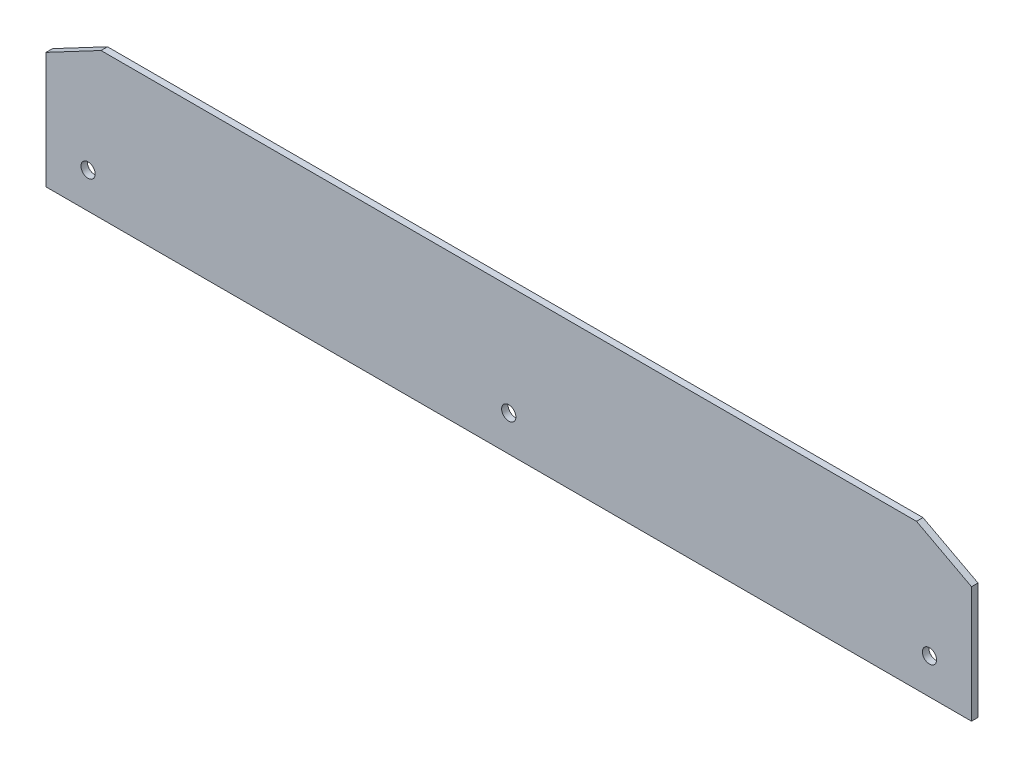
ISO-10303-21;
HEADER;
FILE_DESCRIPTION(('STEP AP214'),'2;1');
FILE_NAME('part.step','',(''),(''),'','','');
FILE_SCHEMA(('AUTOMOTIVE_DESIGN { 1 0 10303 214 1 1 1 1 }'));
ENDSEC;
DATA;
#1=APPLICATION_CONTEXT('core data for automotive mechanical design processes');
#2=APPLICATION_PROTOCOL_DEFINITION('international standard','automotive_design',2000,#1);
#3=PRODUCT_CONTEXT('',#1,'mechanical');
#4=PRODUCT('Part','Part','',(#3));
#5=PRODUCT_RELATED_PRODUCT_CATEGORY('part','',(#4));
#6=PRODUCT_DEFINITION_FORMATION('','',#4);
#7=PRODUCT_DEFINITION_CONTEXT('part definition',#1,'design');
#8=PRODUCT_DEFINITION('design','',#6,#7);
#9=PRODUCT_DEFINITION_SHAPE('','',#8);
#10=(LENGTH_UNIT() NAMED_UNIT(*) SI_UNIT(.MILLI.,.METRE.));
#11=(NAMED_UNIT(*) PLANE_ANGLE_UNIT() SI_UNIT($,.RADIAN.));
#12=(NAMED_UNIT(*) SI_UNIT($,.STERADIAN.) SOLID_ANGLE_UNIT());
#13=UNCERTAINTY_MEASURE_WITH_UNIT(LENGTH_MEASURE(1.E-05),#10,'distance_accuracy_value','');
#14=(GEOMETRIC_REPRESENTATION_CONTEXT(3) GLOBAL_UNCERTAINTY_ASSIGNED_CONTEXT((#13)) GLOBAL_UNIT_ASSIGNED_CONTEXT((#10,
#11,#12)) REPRESENTATION_CONTEXT('',''));
#15=CARTESIAN_POINT('',(0.,0.,0.));
#16=DIRECTION('',(0.,0.,1.));
#17=DIRECTION('',(1.,0.,0.));
#18=AXIS2_PLACEMENT_3D('',#15,#16,#17);
#19=CARTESIAN_POINT('',(0.,0.,2.));
#20=DIRECTION('',(0.,0.,1.));
#21=DIRECTION('',(1.,0.,0.));
#22=AXIS2_PLACEMENT_3D('',#19,#20,#21);
#23=PLANE('',#22);
#24=CARTESIAN_POINT('',(0.,18.,2.));
#25=DIRECTION('',(0.,0.,1.));
#26=DIRECTION('',(1.,0.,0.));
#27=AXIS2_PLACEMENT_3D('',#24,#25,#26);
#28=CIRCLE('',#27,2.2);
#29=CARTESIAN_POINT('',(2.2,18.,2.));
#30=VERTEX_POINT('',#29);
#31=EDGE_CURVE('E211',#30,#30,#28,.T.);
#32=ORIENTED_EDGE('',*,*,#31,.F.);
#33=EDGE_LOOP('',(#32));
#34=FACE_BOUND('',#33,.T.);
#35=DIRECTION('',(0.,-1.,0.));
#36=VECTOR('',#35,1.);
#37=CARTESIAN_POINT('',(-143.,43.,2.));
#38=LINE('',#37,#36);
#39=CARTESIAN_POINT('',(-143.,43.,2.));
#40=VERTEX_POINT('',#39);
#41=CARTESIAN_POINT('',(-143.,7.,2.));
#42=VERTEX_POINT('',#41);
#43=EDGE_CURVE('E154',#40,#42,#38,.T.);
#44=ORIENTED_EDGE('',*,*,#43,.T.);
#45=DIRECTION('',(1.,0.,0.));
#46=VECTOR('',#45,1.);
#47=CARTESIAN_POINT('',(-143.,7.,2.));
#48=LINE('',#47,#46);
#49=CARTESIAN_POINT('',(143.,7.,2.));
#50=VERTEX_POINT('',#49);
#51=EDGE_CURVE('E100',#42,#50,#48,.T.);
#52=ORIENTED_EDGE('',*,*,#51,.T.);
#53=DIRECTION('',(0.,1.,0.));
#54=VECTOR('',#53,1.);
#55=CARTESIAN_POINT('',(143.,7.,2.));
#56=LINE('',#55,#54);
#57=CARTESIAN_POINT('',(143.,43.,2.));
#58=VERTEX_POINT('',#57);
#59=EDGE_CURVE('E113',#50,#58,#56,.T.);
#60=ORIENTED_EDGE('',*,*,#59,.T.);
#61=DIRECTION('',(-0.883787916347062,0.467887720419033,0.));
#62=VECTOR('',#61,1.);
#63=CARTESIAN_POINT('',(143.,43.,2.));
#64=LINE('',#63,#62);
#65=CARTESIAN_POINT('',(126.,52.,2.));
#66=VERTEX_POINT('',#65);
#67=EDGE_CURVE('E107',#58,#66,#64,.T.);
#68=ORIENTED_EDGE('',*,*,#67,.T.);
#69=DIRECTION('',(-1.,0.,0.));
#70=VECTOR('',#69,1.);
#71=CARTESIAN_POINT('',(126.,52.,2.));
#72=LINE('',#71,#70);
#73=CARTESIAN_POINT('',(-126.,52.,2.));
#74=VERTEX_POINT('',#73);
#75=EDGE_CURVE('E111',#66,#74,#72,.T.);
#76=ORIENTED_EDGE('',*,*,#75,.T.);
#77=DIRECTION('',(-0.883787916347062,-0.467887720419033,0.));
#78=VECTOR('',#77,1.);
#79=CARTESIAN_POINT('',(-126.,52.,2.));
#80=LINE('',#79,#78);
#81=EDGE_CURVE('E63',#74,#40,#80,.T.);
#82=ORIENTED_EDGE('',*,*,#81,.T.);
#83=EDGE_LOOP('',(#44,#52,#60,#68,#76,#82));
#84=FACE_BOUND('',#83,.T.);
#85=CARTESIAN_POINT('',(-130.,18.,2.));
#86=DIRECTION('',(0.,0.,1.));
#87=DIRECTION('',(1.,0.,0.));
#88=AXIS2_PLACEMENT_3D('',#85,#86,#87);
#89=CIRCLE('',#88,2.20000000000001);
#90=CARTESIAN_POINT('',(-127.8,18.,2.));
#91=VERTEX_POINT('',#90);
#92=EDGE_CURVE('E142',#91,#91,#89,.T.);
#93=ORIENTED_EDGE('',*,*,#92,.F.);
#94=EDGE_LOOP('',(#93));
#95=FACE_BOUND('',#94,.T.);
#96=CARTESIAN_POINT('',(130.,18.,2.));
#97=DIRECTION('',(0.,0.,1.));
#98=DIRECTION('',(1.,0.,0.));
#99=AXIS2_PLACEMENT_3D('',#96,#97,#98);
#100=CIRCLE('',#99,2.20000000000001);
#101=CARTESIAN_POINT('',(132.2,18.,2.));
#102=VERTEX_POINT('',#101);
#103=EDGE_CURVE('E201',#102,#102,#100,.T.);
#104=ORIENTED_EDGE('',*,*,#103,.F.);
#105=EDGE_LOOP('',(#104));
#106=FACE_BOUND('',#105,.T.);
#107=ADVANCED_FACE('F45',(#34,#84,#95,#106),#23,.T.);
#108=CARTESIAN_POINT('',(0.,0.,0.));
#109=DIRECTION('',(0.,0.,1.));
#110=DIRECTION('',(1.,0.,0.));
#111=AXIS2_PLACEMENT_3D('',#108,#109,#110);
#112=PLANE('',#111);
#113=DIRECTION('',(0.,-1.,0.));
#114=VECTOR('',#113,1.);
#115=CARTESIAN_POINT('',(-143.,43.,0.));
#116=LINE('',#115,#114);
#117=CARTESIAN_POINT('',(-143.,43.,0.));
#118=VERTEX_POINT('',#117);
#119=CARTESIAN_POINT('',(-143.,7.,0.));
#120=VERTEX_POINT('',#119);
#121=EDGE_CURVE('E137',#118,#120,#116,.T.);
#122=ORIENTED_EDGE('',*,*,#121,.F.);
#123=DIRECTION('',(-0.883787916347062,-0.467887720419033,0.));
#124=VECTOR('',#123,1.);
#125=CARTESIAN_POINT('',(-126.,52.,0.));
#126=LINE('',#125,#124);
#127=CARTESIAN_POINT('',(-126.,52.,0.));
#128=VERTEX_POINT('',#127);
#129=EDGE_CURVE('E92',#128,#118,#126,.T.);
#130=ORIENTED_EDGE('',*,*,#129,.F.);
#131=DIRECTION('',(-1.,0.,0.));
#132=VECTOR('',#131,1.);
#133=CARTESIAN_POINT('',(126.,52.,0.));
#134=LINE('',#133,#132);
#135=CARTESIAN_POINT('',(126.,52.,0.));
#136=VERTEX_POINT('',#135);
#137=EDGE_CURVE('E86',#136,#128,#134,.T.);
#138=ORIENTED_EDGE('',*,*,#137,.F.);
#139=DIRECTION('',(-0.883787916347062,0.467887720419033,0.));
#140=VECTOR('',#139,1.);
#141=CARTESIAN_POINT('',(143.,43.,0.));
#142=LINE('',#141,#140);
#143=CARTESIAN_POINT('',(143.,43.,0.));
#144=VERTEX_POINT('',#143);
#145=EDGE_CURVE('E122',#144,#136,#142,.T.);
#146=ORIENTED_EDGE('',*,*,#145,.F.);
#147=DIRECTION('',(0.,1.,0.));
#148=VECTOR('',#147,1.);
#149=CARTESIAN_POINT('',(143.,7.,0.));
#150=LINE('',#149,#148);
#151=CARTESIAN_POINT('',(143.,7.,0.));
#152=VERTEX_POINT('',#151);
#153=EDGE_CURVE('E145',#152,#144,#150,.T.);
#154=ORIENTED_EDGE('',*,*,#153,.F.);
#155=DIRECTION('',(1.,0.,0.));
#156=VECTOR('',#155,1.);
#157=CARTESIAN_POINT('',(-143.,7.,0.));
#158=LINE('',#157,#156);
#159=EDGE_CURVE('E141',#120,#152,#158,.T.);
#160=ORIENTED_EDGE('',*,*,#159,.F.);
#161=EDGE_LOOP('',(#122,#130,#138,#146,#154,#160));
#162=FACE_BOUND('',#161,.T.);
#163=CARTESIAN_POINT('',(-130.,18.,0.));
#164=DIRECTION('',(0.,0.,1.));
#165=DIRECTION('',(1.,0.,0.));
#166=AXIS2_PLACEMENT_3D('',#163,#164,#165);
#167=CIRCLE('',#166,2.20000000000001);
#168=CARTESIAN_POINT('',(-127.8,18.,0.));
#169=VERTEX_POINT('',#168);
#170=EDGE_CURVE('E215',#169,#169,#167,.T.);
#171=ORIENTED_EDGE('',*,*,#170,.T.);
#172=EDGE_LOOP('',(#171));
#173=FACE_BOUND('',#172,.T.);
#174=CARTESIAN_POINT('',(0.,18.,0.));
#175=DIRECTION('',(0.,0.,1.));
#176=DIRECTION('',(1.,0.,0.));
#177=AXIS2_PLACEMENT_3D('',#174,#175,#176);
#178=CIRCLE('',#177,2.2);
#179=CARTESIAN_POINT('',(2.2,18.,0.));
#180=VERTEX_POINT('',#179);
#181=EDGE_CURVE('E208',#180,#180,#178,.T.);
#182=ORIENTED_EDGE('',*,*,#181,.T.);
#183=EDGE_LOOP('',(#182));
#184=FACE_BOUND('',#183,.T.);
#185=CARTESIAN_POINT('',(130.,18.,0.));
#186=DIRECTION('',(0.,0.,1.));
#187=DIRECTION('',(1.,0.,0.));
#188=AXIS2_PLACEMENT_3D('',#185,#186,#187);
#189=CIRCLE('',#188,2.20000000000001);
#190=CARTESIAN_POINT('',(132.2,18.,0.));
#191=VERTEX_POINT('',#190);
#192=EDGE_CURVE('E204',#191,#191,#189,.T.);
#193=ORIENTED_EDGE('',*,*,#192,.T.);
#194=EDGE_LOOP('',(#193));
#195=FACE_BOUND('',#194,.T.);
#196=ADVANCED_FACE('F167',(#162,#173,#184,#195),#112,.F.);
#197=CARTESIAN_POINT('',(-143.,43.,2.));
#198=DIRECTION('',(1.,0.,0.));
#199=DIRECTION('',(0.,0.,-1.));
#200=AXIS2_PLACEMENT_3D('',#197,#198,#199);
#201=PLANE('',#200);
#202=ORIENTED_EDGE('',*,*,#121,.T.);
#203=DIRECTION('',(0.,0.,-1.));
#204=VECTOR('',#203,1.);
#205=CARTESIAN_POINT('',(-143.,7.,2.));
#206=LINE('',#205,#204);
#207=EDGE_CURVE('E11',#42,#120,#206,.T.);
#208=ORIENTED_EDGE('',*,*,#207,.F.);
#209=ORIENTED_EDGE('',*,*,#43,.F.);
#210=DIRECTION('',(0.,0.,-1.));
#211=VECTOR('',#210,1.);
#212=CARTESIAN_POINT('',(-143.,43.,2.));
#213=LINE('',#212,#211);
#214=EDGE_CURVE('E133',#40,#118,#213,.T.);
#215=ORIENTED_EDGE('',*,*,#214,.T.);
#216=EDGE_LOOP('',(#202,#208,#209,#215));
#217=FACE_BOUND('',#216,.T.);
#218=ADVANCED_FACE('F47',(#217),#201,.F.);
#219=CARTESIAN_POINT('',(-143.,7.,2.));
#220=DIRECTION('',(0.,1.,0.));
#221=DIRECTION('',(0.,0.,1.));
#222=AXIS2_PLACEMENT_3D('',#219,#220,#221);
#223=PLANE('',#222);
#224=ORIENTED_EDGE('',*,*,#159,.T.);
#225=DIRECTION('',(0.,0.,-1.));
#226=VECTOR('',#225,1.);
#227=CARTESIAN_POINT('',(143.,7.,2.));
#228=LINE('',#227,#226);
#229=EDGE_CURVE('E55',#50,#152,#228,.T.);
#230=ORIENTED_EDGE('',*,*,#229,.F.);
#231=ORIENTED_EDGE('',*,*,#51,.F.);
#232=ORIENTED_EDGE('',*,*,#207,.T.);
#233=EDGE_LOOP('',(#224,#230,#231,#232));
#234=FACE_BOUND('',#233,.T.);
#235=ADVANCED_FACE('F270',(#234),#223,.F.);
#236=CARTESIAN_POINT('',(143.,7.,2.));
#237=DIRECTION('',(-1.,0.,0.));
#238=DIRECTION('',(0.,0.,1.));
#239=AXIS2_PLACEMENT_3D('',#236,#237,#238);
#240=PLANE('',#239);
#241=ORIENTED_EDGE('',*,*,#153,.T.);
#242=DIRECTION('',(0.,0.,-1.));
#243=VECTOR('',#242,1.);
#244=CARTESIAN_POINT('',(143.,43.,2.));
#245=LINE('',#244,#243);
#246=EDGE_CURVE('E124',#58,#144,#245,.T.);
#247=ORIENTED_EDGE('',*,*,#246,.F.);
#248=ORIENTED_EDGE('',*,*,#59,.F.);
#249=ORIENTED_EDGE('',*,*,#229,.T.);
#250=EDGE_LOOP('',(#241,#247,#248,#249));
#251=FACE_BOUND('',#250,.T.);
#252=ADVANCED_FACE('F164',(#251),#240,.F.);
#253=CARTESIAN_POINT('',(143.,43.,2.));
#254=DIRECTION('',(-0.467887720419033,-0.883787916347062,0.));
#255=DIRECTION('',(0.883787916347062,-0.467887720419033,0.));
#256=AXIS2_PLACEMENT_3D('',#253,#254,#255);
#257=PLANE('',#256);
#258=ORIENTED_EDGE('',*,*,#145,.T.);
#259=DIRECTION('',(0.,0.,-1.));
#260=VECTOR('',#259,1.);
#261=CARTESIAN_POINT('',(126.,52.,2.));
#262=LINE('',#261,#260);
#263=EDGE_CURVE('E119',#66,#136,#262,.T.);
#264=ORIENTED_EDGE('',*,*,#263,.F.);
#265=ORIENTED_EDGE('',*,*,#67,.F.);
#266=ORIENTED_EDGE('',*,*,#246,.T.);
#267=EDGE_LOOP('',(#258,#264,#265,#266));
#268=FACE_BOUND('',#267,.T.);
#269=ADVANCED_FACE('F120',(#268),#257,.F.);
#270=CARTESIAN_POINT('',(126.,52.,2.));
#271=DIRECTION('',(0.,-1.,0.));
#272=DIRECTION('',(0.,0.,-1.));
#273=AXIS2_PLACEMENT_3D('',#270,#271,#272);
#274=PLANE('',#273);
#275=ORIENTED_EDGE('',*,*,#137,.T.);
#276=DIRECTION('',(0.,0.,-1.));
#277=VECTOR('',#276,1.);
#278=CARTESIAN_POINT('',(-126.,52.,2.));
#279=LINE('',#278,#277);
#280=EDGE_CURVE('E125',#74,#128,#279,.T.);
#281=ORIENTED_EDGE('',*,*,#280,.F.);
#282=ORIENTED_EDGE('',*,*,#75,.F.);
#283=ORIENTED_EDGE('',*,*,#263,.T.);
#284=EDGE_LOOP('',(#275,#281,#282,#283));
#285=FACE_BOUND('',#284,.T.);
#286=ADVANCED_FACE('F127',(#285),#274,.F.);
#287=CARTESIAN_POINT('',(-126.,52.,2.));
#288=DIRECTION('',(0.467887720419033,-0.883787916347062,0.));
#289=DIRECTION('',(0.883787916347062,0.467887720419033,0.));
#290=AXIS2_PLACEMENT_3D('',#287,#288,#289);
#291=PLANE('',#290);
#292=ORIENTED_EDGE('',*,*,#129,.T.);
#293=ORIENTED_EDGE('',*,*,#214,.F.);
#294=ORIENTED_EDGE('',*,*,#81,.F.);
#295=ORIENTED_EDGE('',*,*,#280,.T.);
#296=EDGE_LOOP('',(#292,#293,#294,#295));
#297=FACE_BOUND('',#296,.T.);
#298=ADVANCED_FACE('F172',(#297),#291,.F.);
#299=CARTESIAN_POINT('',(-130.,18.,2.));
#300=DIRECTION('',(0.,0.,-1.));
#301=DIRECTION('',(-1.,0.,0.));
#302=AXIS2_PLACEMENT_3D('',#299,#300,#301);
#303=CYLINDRICAL_SURFACE('',#302,2.20000000000001);
#304=ORIENTED_EDGE('',*,*,#92,.T.);
#305=EDGE_LOOP('',(#304));
#306=FACE_BOUND('',#305,.T.);
#307=ORIENTED_EDGE('',*,*,#170,.F.);
#308=EDGE_LOOP('',(#307));
#309=FACE_BOUND('',#308,.T.);
#310=ADVANCED_FACE('F174',(#306,#309),#303,.F.);
#311=CARTESIAN_POINT('',(0.,18.,2.));
#312=DIRECTION('',(0.,0.,-1.));
#313=DIRECTION('',(-1.,0.,0.));
#314=AXIS2_PLACEMENT_3D('',#311,#312,#313);
#315=CYLINDRICAL_SURFACE('',#314,2.2);
#316=ORIENTED_EDGE('',*,*,#31,.T.);
#317=EDGE_LOOP('',(#316));
#318=FACE_BOUND('',#317,.T.);
#319=ORIENTED_EDGE('',*,*,#181,.F.);
#320=EDGE_LOOP('',(#319));
#321=FACE_BOUND('',#320,.T.);
#322=ADVANCED_FACE('F179',(#318,#321),#315,.F.);
#323=CARTESIAN_POINT('',(130.,18.,2.));
#324=DIRECTION('',(0.,0.,-1.));
#325=DIRECTION('',(-1.,0.,0.));
#326=AXIS2_PLACEMENT_3D('',#323,#324,#325);
#327=CYLINDRICAL_SURFACE('',#326,2.20000000000001);
#328=ORIENTED_EDGE('',*,*,#103,.T.);
#329=EDGE_LOOP('',(#328));
#330=FACE_BOUND('',#329,.T.);
#331=ORIENTED_EDGE('',*,*,#192,.F.);
#332=EDGE_LOOP('',(#331));
#333=FACE_BOUND('',#332,.T.);
#334=ADVANCED_FACE('F193',(#330,#333),#327,.F.);
#335=CLOSED_SHELL('',(#107,#196,#218,#235,#252,#269,#286,#298,#310,#322,#334));
#336=MANIFOLD_SOLID_BREP('B2',#335);
#337=ADVANCED_BREP_SHAPE_REPRESENTATION('',(#18,#336),#14);
#338=SHAPE_DEFINITION_REPRESENTATION(#9,#337);
ENDSEC;
END-ISO-10303-21;
